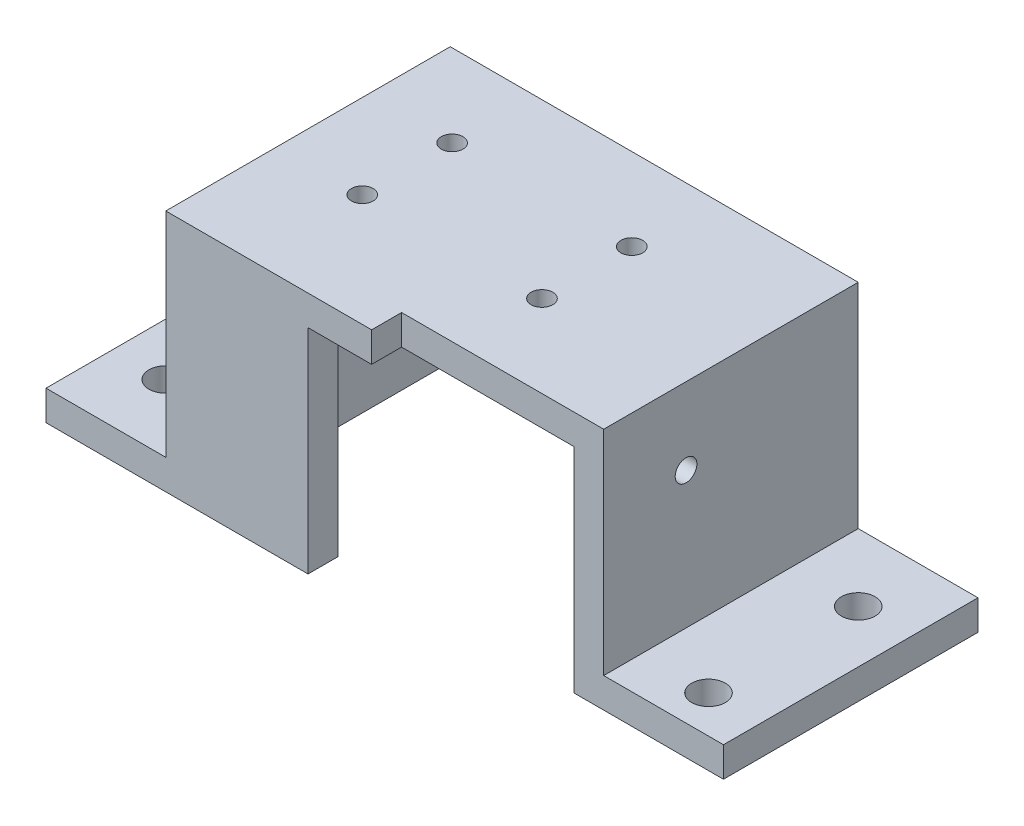
ISO-10303-21;
HEADER;
FILE_DESCRIPTION(('STEP AP214'),'2;1');
FILE_NAME('part.step','',(''),(''),'','','');
FILE_SCHEMA(('AUTOMOTIVE_DESIGN { 1 0 10303 214 1 1 1 1 }'));
ENDSEC;
DATA;
#1=APPLICATION_CONTEXT('core data for automotive mechanical design processes');
#2=APPLICATION_PROTOCOL_DEFINITION('international standard','automotive_design',2000,#1);
#3=PRODUCT_CONTEXT('',#1,'mechanical');
#4=PRODUCT('Part','Part','',(#3));
#5=PRODUCT_RELATED_PRODUCT_CATEGORY('part','',(#4));
#6=PRODUCT_DEFINITION_FORMATION('','',#4);
#7=PRODUCT_DEFINITION_CONTEXT('part definition',#1,'design');
#8=PRODUCT_DEFINITION('design','',#6,#7);
#9=PRODUCT_DEFINITION_SHAPE('','',#8);
#10=(LENGTH_UNIT() NAMED_UNIT(*) SI_UNIT(.MILLI.,.METRE.));
#11=(NAMED_UNIT(*) PLANE_ANGLE_UNIT() SI_UNIT($,.RADIAN.));
#12=(NAMED_UNIT(*) SI_UNIT($,.STERADIAN.) SOLID_ANGLE_UNIT());
#13=UNCERTAINTY_MEASURE_WITH_UNIT(LENGTH_MEASURE(1.E-05),#10,'distance_accuracy_value','');
#14=(GEOMETRIC_REPRESENTATION_CONTEXT(3) GLOBAL_UNCERTAINTY_ASSIGNED_CONTEXT((#13)) GLOBAL_UNIT_ASSIGNED_CONTEXT((#10,
#11,#12)) REPRESENTATION_CONTEXT('',''));
#15=CARTESIAN_POINT('',(0.,0.,0.));
#16=DIRECTION('',(0.,0.,1.));
#17=DIRECTION('',(1.,0.,0.));
#18=AXIS2_PLACEMENT_3D('',#15,#16,#17);
#19=CARTESIAN_POINT('',(0.,-24.5,0.));
#20=DIRECTION('',(0.,-1.,0.));
#21=DIRECTION('',(0.,0.,-1.));
#22=AXIS2_PLACEMENT_3D('',#19,#20,#21);
#23=PLANE('',#22);
#24=CARTESIAN_POINT('',(36.25,-24.5,10.));
#25=DIRECTION('',(0.,1.,0.));
#26=DIRECTION('',(0.,0.,1.));
#27=AXIS2_PLACEMENT_3D('',#24,#25,#26);
#28=CIRCLE('',#27,2.25);
#29=CARTESIAN_POINT('',(36.25,-24.5,12.25));
#30=VERTEX_POINT('',#29);
#31=EDGE_CURVE('E209',#30,#30,#28,.T.);
#32=ORIENTED_EDGE('',*,*,#31,.F.);
#33=EDGE_LOOP('',(#32));
#34=FACE_BOUND('',#33,.T.);
#35=CARTESIAN_POINT('',(36.25,-24.5,-10.));
#36=DIRECTION('',(0.,1.,0.));
#37=DIRECTION('',(0.,0.,1.));
#38=AXIS2_PLACEMENT_3D('',#35,#36,#37);
#39=CIRCLE('',#38,2.25);
#40=CARTESIAN_POINT('',(36.25,-24.5,-7.75));
#41=VERTEX_POINT('',#40);
#42=EDGE_CURVE('E201',#41,#41,#39,.T.);
#43=ORIENTED_EDGE('',*,*,#42,.F.);
#44=EDGE_LOOP('',(#43));
#45=FACE_BOUND('',#44,.T.);
#46=DIRECTION('',(-1.,0.,0.));
#47=VECTOR('',#46,1.);
#48=CARTESIAN_POINT('',(0.,-24.5,15.));
#49=LINE('',#48,#47);
#50=CARTESIAN_POINT('',(43.25,-24.5,15.));
#51=VERTEX_POINT('',#50);
#52=CARTESIAN_POINT('',(27.25,-24.5,15.));
#53=VERTEX_POINT('',#52);
#54=EDGE_CURVE('E196',#51,#53,#49,.T.);
#55=ORIENTED_EDGE('',*,*,#54,.F.);
#56=DIRECTION('',(0.,0.,1.));
#57=VECTOR('',#56,1.);
#58=CARTESIAN_POINT('',(43.25,-24.5,19.));
#59=LINE('',#58,#57);
#60=CARTESIAN_POINT('',(43.25,-24.5,-19.));
#61=VERTEX_POINT('',#60);
#62=EDGE_CURVE('E313',#61,#51,#59,.T.);
#63=ORIENTED_EDGE('',*,*,#62,.F.);
#64=DIRECTION('',(1.,0.,0.));
#65=VECTOR('',#64,1.);
#66=CARTESIAN_POINT('',(27.25,-24.5,-19.));
#67=LINE('',#66,#65);
#68=CARTESIAN_POINT('',(27.25,-24.5,-19.));
#69=VERTEX_POINT('',#68);
#70=EDGE_CURVE('E309',#69,#61,#67,.T.);
#71=ORIENTED_EDGE('',*,*,#70,.F.);
#72=DIRECTION('',(0.,0.,-1.));
#73=VECTOR('',#72,1.);
#74=CARTESIAN_POINT('',(27.25,-24.5,19.));
#75=LINE('',#74,#73);
#76=EDGE_CURVE('E65',#53,#69,#75,.T.);
#77=ORIENTED_EDGE('',*,*,#76,.F.);
#78=EDGE_LOOP('',(#55,#63,#71,#77));
#79=FACE_BOUND('',#78,.T.);
#80=ADVANCED_FACE('F39',(#34,#45,#79),#23,.F.);
#81=CARTESIAN_POINT('',(27.25,4.,-19.));
#82=DIRECTION('',(-1.,0.,0.));
#83=DIRECTION('',(0.,0.,1.));
#84=AXIS2_PLACEMENT_3D('',#81,#82,#83);
#85=PLANE('',#84);
#86=CARTESIAN_POINT('',(27.25,-6.25,3.99999999999999));
#87=DIRECTION('',(1.,0.,0.));
#88=DIRECTION('',(0.,0.,-1.));
#89=AXIS2_PLACEMENT_3D('',#86,#87,#88);
#90=CIRCLE('',#89,1.44999999999999);
#91=CARTESIAN_POINT('',(27.25,-6.25,2.55000000000001));
#92=VERTEX_POINT('',#91);
#93=EDGE_CURVE('E249',#92,#92,#90,.T.);
#94=ORIENTED_EDGE('',*,*,#93,.F.);
#95=EDGE_LOOP('',(#94));
#96=FACE_BOUND('',#95,.T.);
#97=DIRECTION('',(0.,1.,0.));
#98=VECTOR('',#97,1.);
#99=CARTESIAN_POINT('',(27.25,4.,15.));
#100=LINE('',#99,#98);
#101=CARTESIAN_POINT('',(27.25,4.,15.));
#102=VERTEX_POINT('',#101);
#103=EDGE_CURVE('E161',#53,#102,#100,.T.);
#104=ORIENTED_EDGE('',*,*,#103,.F.);
#105=ORIENTED_EDGE('',*,*,#76,.T.);
#106=DIRECTION('',(0.,-1.,0.));
#107=VECTOR('',#106,1.);
#108=CARTESIAN_POINT('',(27.25,4.,-19.));
#109=LINE('',#108,#107);
#110=CARTESIAN_POINT('',(27.25,4.,-19.));
#111=VERTEX_POINT('',#110);
#112=EDGE_CURVE('E11',#111,#69,#109,.T.);
#113=ORIENTED_EDGE('',*,*,#112,.F.);
#114=DIRECTION('',(0.,0.,-1.));
#115=VECTOR('',#114,1.);
#116=CARTESIAN_POINT('',(27.25,4.,-19.));
#117=LINE('',#116,#115);
#118=EDGE_CURVE('E383',#102,#111,#117,.T.);
#119=ORIENTED_EDGE('',*,*,#118,.F.);
#120=EDGE_LOOP('',(#104,#105,#113,#119));
#121=FACE_BOUND('',#120,.T.);
#122=ADVANCED_FACE('F41',(#96,#121),#85,.F.);
#123=CARTESIAN_POINT('',(23.25,-28.5,19.));
#124=DIRECTION('',(1.,0.,0.));
#125=DIRECTION('',(0.,0.,-1.));
#126=AXIS2_PLACEMENT_3D('',#123,#124,#125);
#127=PLANE('',#126);
#128=CARTESIAN_POINT('',(23.25,-6.25,3.99999999999999));
#129=DIRECTION('',(1.,0.,0.));
#130=DIRECTION('',(0.,0.,-1.));
#131=AXIS2_PLACEMENT_3D('',#128,#129,#130);
#132=CIRCLE('',#131,1.44999999999999);
#133=CARTESIAN_POINT('',(23.25,-6.25,2.55000000000001));
#134=VERTEX_POINT('',#133);
#135=EDGE_CURVE('E43',#134,#134,#132,.T.);
#136=ORIENTED_EDGE('',*,*,#135,.T.);
#137=EDGE_LOOP('',(#136));
#138=FACE_BOUND('',#137,.T.);
#139=DIRECTION('',(0.,-1.,0.));
#140=VECTOR('',#139,1.);
#141=CARTESIAN_POINT('',(23.25,-28.5,15.));
#142=LINE('',#141,#140);
#143=CARTESIAN_POINT('',(23.25,0.,15.));
#144=VERTEX_POINT('',#143);
#145=CARTESIAN_POINT('',(23.25,-28.5,15.));
#146=VERTEX_POINT('',#145);
#147=EDGE_CURVE('E182',#144,#146,#142,.T.);
#148=ORIENTED_EDGE('',*,*,#147,.F.);
#149=DIRECTION('',(0.,0.,-1.));
#150=VECTOR('',#149,1.);
#151=CARTESIAN_POINT('',(23.25,0.,19.));
#152=LINE('',#151,#150);
#153=CARTESIAN_POINT('',(23.25,0.,-19.));
#154=VERTEX_POINT('',#153);
#155=EDGE_CURVE('E369',#144,#154,#152,.T.);
#156=ORIENTED_EDGE('',*,*,#155,.T.);
#157=DIRECTION('',(0.,1.,0.));
#158=VECTOR('',#157,1.);
#159=CARTESIAN_POINT('',(23.25,-28.5,-19.));
#160=LINE('',#159,#158);
#161=CARTESIAN_POINT('',(23.25,-28.5,-19.));
#162=VERTEX_POINT('',#161);
#163=EDGE_CURVE('E376',#162,#154,#160,.T.);
#164=ORIENTED_EDGE('',*,*,#163,.F.);
#165=DIRECTION('',(0.,0.,-1.));
#166=VECTOR('',#165,1.);
#167=CARTESIAN_POINT('',(23.25,-28.5,19.));
#168=LINE('',#167,#166);
#169=EDGE_CURVE('E370',#146,#162,#168,.T.);
#170=ORIENTED_EDGE('',*,*,#169,.F.);
#171=EDGE_LOOP('',(#148,#156,#164,#170));
#172=FACE_BOUND('',#171,.T.);
#173=ADVANCED_FACE('F436',(#138,#172),#127,.F.);
#174=CARTESIAN_POINT('',(0.,-28.5,0.));
#175=DIRECTION('',(0.,1.,0.));
#176=DIRECTION('',(0.,0.,1.));
#177=AXIS2_PLACEMENT_3D('',#174,#175,#176);
#178=PLANE('',#177);
#179=CARTESIAN_POINT('',(36.25,-28.5,10.));
#180=DIRECTION('',(0.,1.,0.));
#181=DIRECTION('',(0.,0.,1.));
#182=AXIS2_PLACEMENT_3D('',#179,#180,#181);
#183=CIRCLE('',#182,2.25);
#184=CARTESIAN_POINT('',(36.25,-28.5,12.25));
#185=VERTEX_POINT('',#184);
#186=EDGE_CURVE('E213',#185,#185,#183,.T.);
#187=ORIENTED_EDGE('',*,*,#186,.T.);
#188=EDGE_LOOP('',(#187));
#189=FACE_BOUND('',#188,.T.);
#190=CARTESIAN_POINT('',(36.25,-28.5,-10.));
#191=DIRECTION('',(0.,1.,0.));
#192=DIRECTION('',(0.,0.,1.));
#193=AXIS2_PLACEMENT_3D('',#190,#191,#192);
#194=CIRCLE('',#193,2.25);
#195=CARTESIAN_POINT('',(36.25,-28.5,-7.75));
#196=VERTEX_POINT('',#195);
#197=EDGE_CURVE('E205',#196,#196,#194,.T.);
#198=ORIENTED_EDGE('',*,*,#197,.T.);
#199=EDGE_LOOP('',(#198));
#200=FACE_BOUND('',#199,.T.);
#201=DIRECTION('',(1.,0.,0.));
#202=VECTOR('',#201,1.);
#203=CARTESIAN_POINT('',(43.25,-28.5,15.));
#204=LINE('',#203,#202);
#205=CARTESIAN_POINT('',(43.25,-28.5,15.));
#206=VERTEX_POINT('',#205);
#207=EDGE_CURVE('E57',#146,#206,#204,.T.);
#208=ORIENTED_EDGE('',*,*,#207,.F.);
#209=ORIENTED_EDGE('',*,*,#169,.T.);
#210=DIRECTION('',(1.,0.,0.));
#211=VECTOR('',#210,1.);
#212=CARTESIAN_POINT('',(27.25,-28.5,-19.));
#213=LINE('',#212,#211);
#214=CARTESIAN_POINT('',(43.25,-28.5,-19.));
#215=VERTEX_POINT('',#214);
#216=EDGE_CURVE('E373',#162,#215,#213,.T.);
#217=ORIENTED_EDGE('',*,*,#216,.T.);
#218=DIRECTION('',(0.,0.,1.));
#219=VECTOR('',#218,1.);
#220=CARTESIAN_POINT('',(43.25,-28.5,19.));
#221=LINE('',#220,#219);
#222=EDGE_CURVE('E306',#215,#206,#221,.T.);
#223=ORIENTED_EDGE('',*,*,#222,.T.);
#224=EDGE_LOOP('',(#208,#209,#217,#223));
#225=FACE_BOUND('',#224,.T.);
#226=ADVANCED_FACE('F445',(#189,#200,#225),#178,.F.);
#227=CARTESIAN_POINT('',(43.25,-24.5,19.));
#228=DIRECTION('',(1.,0.,0.));
#229=DIRECTION('',(0.,0.,-1.));
#230=AXIS2_PLACEMENT_3D('',#227,#228,#229);
#231=PLANE('',#230);
#232=ORIENTED_EDGE('',*,*,#62,.T.);
#233=DIRECTION('',(0.,1.,0.));
#234=VECTOR('',#233,1.);
#235=CARTESIAN_POINT('',(43.25,-28.5,15.));
#236=LINE('',#235,#234);
#237=EDGE_CURVE('E166',#206,#51,#236,.T.);
#238=ORIENTED_EDGE('',*,*,#237,.F.);
#239=ORIENTED_EDGE('',*,*,#222,.F.);
#240=DIRECTION('',(0.,-1.,0.));
#241=VECTOR('',#240,1.);
#242=CARTESIAN_POINT('',(43.25,-24.5,-19.));
#243=LINE('',#242,#241);
#244=EDGE_CURVE('E317',#61,#215,#243,.T.);
#245=ORIENTED_EDGE('',*,*,#244,.F.);
#246=EDGE_LOOP('',(#232,#238,#239,#245));
#247=FACE_BOUND('',#246,.T.);
#248=ADVANCED_FACE('F442',(#247),#231,.T.);
#249=CARTESIAN_POINT('',(0.,0.,0.));
#250=DIRECTION('',(0.,1.,0.));
#251=DIRECTION('',(0.,0.,1.));
#252=AXIS2_PLACEMENT_3D('',#249,#250,#251);
#253=PLANE('',#252);
#254=CARTESIAN_POINT('',(8.,0.,-8.));
#255=DIRECTION('',(0.,1.,0.));
#256=DIRECTION('',(0.,0.,1.));
#257=AXIS2_PLACEMENT_3D('',#254,#255,#256);
#258=CIRCLE('',#257,1.44999999999999);
#259=CARTESIAN_POINT('',(8.,0.,-6.55000000000001));
#260=VERTEX_POINT('',#259);
#261=EDGE_CURVE('E257',#260,#260,#258,.T.);
#262=ORIENTED_EDGE('',*,*,#261,.T.);
#263=EDGE_LOOP('',(#262));
#264=FACE_BOUND('',#263,.T.);
#265=CARTESIAN_POINT('',(7.99999999999999,0.,4.));
#266=DIRECTION('',(0.,1.,0.));
#267=DIRECTION('',(0.,0.,1.));
#268=AXIS2_PLACEMENT_3D('',#265,#266,#267);
#269=CIRCLE('',#268,1.44999999999999);
#270=CARTESIAN_POINT('',(7.99999999999999,0.,5.44999999999999));
#271=VERTEX_POINT('',#270);
#272=EDGE_CURVE('E265',#271,#271,#269,.T.);
#273=ORIENTED_EDGE('',*,*,#272,.T.);
#274=EDGE_LOOP('',(#273));
#275=FACE_BOUND('',#274,.T.);
#276=CARTESIAN_POINT('',(-16.,0.,4.));
#277=DIRECTION('',(0.,1.,0.));
#278=DIRECTION('',(0.,0.,1.));
#279=AXIS2_PLACEMENT_3D('',#276,#277,#278);
#280=CIRCLE('',#279,1.44999999999999);
#281=CARTESIAN_POINT('',(-16.,0.,5.44999999999999));
#282=VERTEX_POINT('',#281);
#283=EDGE_CURVE('E273',#282,#282,#280,.T.);
#284=ORIENTED_EDGE('',*,*,#283,.T.);
#285=EDGE_LOOP('',(#284));
#286=FACE_BOUND('',#285,.T.);
#287=CARTESIAN_POINT('',(-16.,0.,-8.));
#288=DIRECTION('',(0.,1.,0.));
#289=DIRECTION('',(0.,0.,1.));
#290=AXIS2_PLACEMENT_3D('',#287,#288,#289);
#291=CIRCLE('',#290,1.44999999999999);
#292=CARTESIAN_POINT('',(-16.,0.,-6.55000000000001));
#293=VERTEX_POINT('',#292);
#294=EDGE_CURVE('E281',#293,#293,#291,.T.);
#295=ORIENTED_EDGE('',*,*,#294,.T.);
#296=EDGE_LOOP('',(#295));
#297=FACE_BOUND('',#296,.T.);
#298=DIRECTION('',(1.,0.,0.));
#299=VECTOR('',#298,1.);
#300=CARTESIAN_POINT('',(0.,0.,15.));
#301=LINE('',#300,#299);
#302=CARTESIAN_POINT('',(0.25,0.,15.));
#303=VERTEX_POINT('',#302);
#304=EDGE_CURVE('E186',#303,#144,#301,.T.);
#305=ORIENTED_EDGE('',*,*,#304,.F.);
#306=DIRECTION('',(0.,0.,1.));
#307=VECTOR('',#306,1.);
#308=CARTESIAN_POINT('',(0.25,0.,0.));
#309=LINE('',#308,#307);
#310=CARTESIAN_POINT('',(0.25,0.,19.));
#311=VERTEX_POINT('',#310);
#312=EDGE_CURVE('E173',#303,#311,#309,.T.);
#313=ORIENTED_EDGE('',*,*,#312,.T.);
#314=DIRECTION('',(1.,0.,0.));
#315=VECTOR('',#314,1.);
#316=CARTESIAN_POINT('',(-27.25,0.,19.));
#317=LINE('',#316,#315);
#318=CARTESIAN_POINT('',(-8.25,0.,19.));
#319=VERTEX_POINT('',#318);
#320=EDGE_CURVE('E387',#319,#311,#317,.T.);
#321=ORIENTED_EDGE('',*,*,#320,.F.);
#322=DIRECTION('',(0.,0.,1.));
#323=VECTOR('',#322,1.);
#324=CARTESIAN_POINT('',(-8.25,0.,19.));
#325=LINE('',#324,#323);
#326=CARTESIAN_POINT('',(-8.25,0.,15.));
#327=VERTEX_POINT('',#326);
#328=EDGE_CURVE('E286',#327,#319,#325,.T.);
#329=ORIENTED_EDGE('',*,*,#328,.F.);
#330=DIRECTION('',(1.,0.,0.));
#331=VECTOR('',#330,1.);
#332=CARTESIAN_POINT('',(-23.25,0.,15.));
#333=LINE('',#332,#331);
#334=CARTESIAN_POINT('',(-23.25,0.,15.));
#335=VERTEX_POINT('',#334);
#336=EDGE_CURVE('E291',#335,#327,#333,.T.);
#337=ORIENTED_EDGE('',*,*,#336,.F.);
#338=DIRECTION('',(0.,0.,1.));
#339=VECTOR('',#338,1.);
#340=CARTESIAN_POINT('',(-23.25,0.,19.));
#341=LINE('',#340,#339);
#342=CARTESIAN_POINT('',(-23.25,0.,-19.));
#343=VERTEX_POINT('',#342);
#344=EDGE_CURVE('E349',#343,#335,#341,.T.);
#345=ORIENTED_EDGE('',*,*,#344,.F.);
#346=DIRECTION('',(-1.,0.,0.));
#347=VECTOR('',#346,1.);
#348=CARTESIAN_POINT('',(-27.25,0.,-19.));
#349=LINE('',#348,#347);
#350=EDGE_CURVE('E382',#154,#343,#349,.T.);
#351=ORIENTED_EDGE('',*,*,#350,.F.);
#352=ORIENTED_EDGE('',*,*,#155,.F.);
#353=EDGE_LOOP('',(#305,#313,#321,#329,#337,#345,#351,#352));
#354=FACE_BOUND('',#353,.T.);
#355=ADVANCED_FACE('F411',(#264,#275,#286,#297,#354),#253,.F.);
#356=CARTESIAN_POINT('',(-23.25,-28.5,19.));
#357=DIRECTION('',(-1.,0.,0.));
#358=DIRECTION('',(0.,0.,1.));
#359=AXIS2_PLACEMENT_3D('',#356,#357,#358);
#360=PLANE('',#359);
#361=CARTESIAN_POINT('',(-23.25,-6.25,4.));
#362=DIRECTION('',(-1.,0.,0.));
#363=DIRECTION('',(0.,0.,1.));
#364=AXIS2_PLACEMENT_3D('',#361,#362,#363);
#365=CIRCLE('',#364,1.44999999999999);
#366=CARTESIAN_POINT('',(-23.25,-6.25,5.44999999999999));
#367=VERTEX_POINT('',#366);
#368=EDGE_CURVE('E237',#367,#367,#365,.T.);
#369=ORIENTED_EDGE('',*,*,#368,.T.);
#370=EDGE_LOOP('',(#369));
#371=FACE_BOUND('',#370,.T.);
#372=CARTESIAN_POINT('',(-23.25,-6.25,-8.));
#373=DIRECTION('',(-1.,0.,0.));
#374=DIRECTION('',(0.,0.,1.));
#375=AXIS2_PLACEMENT_3D('',#372,#373,#374);
#376=CIRCLE('',#375,1.44999999999999);
#377=CARTESIAN_POINT('',(-23.25,-6.25,-6.55000000000001));
#378=VERTEX_POINT('',#377);
#379=EDGE_CURVE('E245',#378,#378,#376,.T.);
#380=ORIENTED_EDGE('',*,*,#379,.T.);
#381=EDGE_LOOP('',(#380));
#382=FACE_BOUND('',#381,.T.);
#383=DIRECTION('',(0.,1.,0.));
#384=VECTOR('',#383,1.);
#385=CARTESIAN_POINT('',(-23.25,-28.5,15.));
#386=LINE('',#385,#384);
#387=CARTESIAN_POINT('',(-23.25,-28.5,15.));
#388=VERTEX_POINT('',#387);
#389=EDGE_CURVE('E303',#388,#335,#386,.T.);
#390=ORIENTED_EDGE('',*,*,#389,.F.);
#391=DIRECTION('',(0.,0.,1.));
#392=VECTOR('',#391,1.);
#393=CARTESIAN_POINT('',(-23.25,-28.5,19.));
#394=LINE('',#393,#392);
#395=CARTESIAN_POINT('',(-23.25,-28.5,-19.));
#396=VERTEX_POINT('',#395);
#397=EDGE_CURVE('E356',#396,#388,#394,.T.);
#398=ORIENTED_EDGE('',*,*,#397,.F.);
#399=DIRECTION('',(0.,1.,0.));
#400=VECTOR('',#399,1.);
#401=CARTESIAN_POINT('',(-23.25,-28.5,-19.));
#402=LINE('',#401,#400);
#403=EDGE_CURVE('E363',#396,#343,#402,.T.);
#404=ORIENTED_EDGE('',*,*,#403,.T.);
#405=ORIENTED_EDGE('',*,*,#344,.T.);
#406=EDGE_LOOP('',(#390,#398,#404,#405));
#407=FACE_BOUND('',#406,.T.);
#408=ADVANCED_FACE('F459',(#371,#382,#407),#360,.F.);
#409=CARTESIAN_POINT('',(-27.25,4.,-19.));
#410=DIRECTION('',(0.,0.,1.));
#411=DIRECTION('',(1.,0.,0.));
#412=AXIS2_PLACEMENT_3D('',#409,#410,#411);
#413=PLANE('',#412);
#414=ORIENTED_EDGE('',*,*,#112,.T.);
#415=ORIENTED_EDGE('',*,*,#70,.T.);
#416=ORIENTED_EDGE('',*,*,#244,.T.);
#417=ORIENTED_EDGE('',*,*,#216,.F.);
#418=ORIENTED_EDGE('',*,*,#163,.T.);
#419=ORIENTED_EDGE('',*,*,#350,.T.);
#420=ORIENTED_EDGE('',*,*,#403,.F.);
#421=DIRECTION('',(1.,0.,0.));
#422=VECTOR('',#421,1.);
#423=CARTESIAN_POINT('',(-27.25,-28.5,-19.));
#424=LINE('',#423,#422);
#425=CARTESIAN_POINT('',(-43.25,-28.5,-19.));
#426=VERTEX_POINT('',#425);
#427=EDGE_CURVE('E353',#426,#396,#424,.T.);
#428=ORIENTED_EDGE('',*,*,#427,.F.);
#429=DIRECTION('',(0.,-1.,0.));
#430=VECTOR('',#429,1.);
#431=CARTESIAN_POINT('',(-43.25,-24.5,-19.));
#432=LINE('',#431,#430);
#433=CARTESIAN_POINT('',(-43.25,-24.5,-19.));
#434=VERTEX_POINT('',#433);
#435=EDGE_CURVE('E345',#434,#426,#432,.T.);
#436=ORIENTED_EDGE('',*,*,#435,.F.);
#437=DIRECTION('',(1.,0.,0.));
#438=VECTOR('',#437,1.);
#439=CARTESIAN_POINT('',(-27.25,-24.5,-19.));
#440=LINE('',#439,#438);
#441=CARTESIAN_POINT('',(-27.25,-24.5,-19.));
#442=VERTEX_POINT('',#441);
#443=EDGE_CURVE('E337',#434,#442,#440,.T.);
#444=ORIENTED_EDGE('',*,*,#443,.T.);
#445=DIRECTION('',(0.,-1.,0.));
#446=VECTOR('',#445,1.);
#447=CARTESIAN_POINT('',(-27.25,4.,-19.));
#448=LINE('',#447,#446);
#449=CARTESIAN_POINT('',(-27.25,4.,-19.));
#450=VERTEX_POINT('',#449);
#451=EDGE_CURVE('E49',#450,#442,#448,.T.);
#452=ORIENTED_EDGE('',*,*,#451,.F.);
#453=DIRECTION('',(-1.,0.,0.));
#454=VECTOR('',#453,1.);
#455=CARTESIAN_POINT('',(-27.25,4.,-19.));
#456=LINE('',#455,#454);
#457=EDGE_CURVE('E386',#111,#450,#456,.T.);
#458=ORIENTED_EDGE('',*,*,#457,.F.);
#459=EDGE_LOOP('',(#414,#415,#416,#417,#418,#419,#420,#428,#436,#444,#452,#458));
#460=FACE_BOUND('',#459,.T.);
#461=ADVANCED_FACE('F462',(#460),#413,.F.);
#462=CARTESIAN_POINT('',(-27.25,4.,-19.));
#463=DIRECTION('',(1.,0.,0.));
#464=DIRECTION('',(0.,0.,-1.));
#465=AXIS2_PLACEMENT_3D('',#462,#463,#464);
#466=PLANE('',#465);
#467=CARTESIAN_POINT('',(-27.25,-6.25,4.));
#468=DIRECTION('',(-1.,0.,0.));
#469=DIRECTION('',(0.,0.,1.));
#470=AXIS2_PLACEMENT_3D('',#467,#468,#469);
#471=CIRCLE('',#470,1.44999999999999);
#472=CARTESIAN_POINT('',(-27.25,-6.25,5.44999999999999));
#473=VERTEX_POINT('',#472);
#474=EDGE_CURVE('E233',#473,#473,#471,.T.);
#475=ORIENTED_EDGE('',*,*,#474,.F.);
#476=EDGE_LOOP('',(#475));
#477=FACE_BOUND('',#476,.T.);
#478=CARTESIAN_POINT('',(-27.25,-6.25,-8.));
#479=DIRECTION('',(-1.,0.,0.));
#480=DIRECTION('',(0.,0.,1.));
#481=AXIS2_PLACEMENT_3D('',#478,#479,#480);
#482=CIRCLE('',#481,1.44999999999999);
#483=CARTESIAN_POINT('',(-27.25,-6.25,-6.55000000000001));
#484=VERTEX_POINT('',#483);
#485=EDGE_CURVE('E241',#484,#484,#482,.T.);
#486=ORIENTED_EDGE('',*,*,#485,.F.);
#487=EDGE_LOOP('',(#486));
#488=FACE_BOUND('',#487,.T.);
#489=ORIENTED_EDGE('',*,*,#451,.T.);
#490=DIRECTION('',(0.,0.,1.));
#491=VECTOR('',#490,1.);
#492=CARTESIAN_POINT('',(-27.25,-24.5,19.));
#493=LINE('',#492,#491);
#494=CARTESIAN_POINT('',(-27.25,-24.5,19.));
#495=VERTEX_POINT('',#494);
#496=EDGE_CURVE('E325',#442,#495,#493,.T.);
#497=ORIENTED_EDGE('',*,*,#496,.T.);
#498=DIRECTION('',(0.,-1.,0.));
#499=VECTOR('',#498,1.);
#500=CARTESIAN_POINT('',(-27.25,4.,19.));
#501=LINE('',#500,#499);
#502=CARTESIAN_POINT('',(-27.25,4.,19.));
#503=VERTEX_POINT('',#502);
#504=EDGE_CURVE('E395',#503,#495,#501,.T.);
#505=ORIENTED_EDGE('',*,*,#504,.F.);
#506=DIRECTION('',(0.,0.,1.));
#507=VECTOR('',#506,1.);
#508=CARTESIAN_POINT('',(-27.25,4.,-19.));
#509=LINE('',#508,#507);
#510=EDGE_CURVE('E390',#450,#503,#509,.T.);
#511=ORIENTED_EDGE('',*,*,#510,.F.);
#512=EDGE_LOOP('',(#489,#497,#505,#511));
#513=FACE_BOUND('',#512,.T.);
#514=ADVANCED_FACE('F478',(#477,#488,#513),#466,.F.);
#515=CARTESIAN_POINT('',(-27.25,4.,19.));
#516=DIRECTION('',(0.,0.,-1.));
#517=DIRECTION('',(-1.,0.,0.));
#518=AXIS2_PLACEMENT_3D('',#515,#516,#517);
#519=PLANE('',#518);
#520=ORIENTED_EDGE('',*,*,#320,.T.);
#521=DIRECTION('',(0.,-1.,0.));
#522=VECTOR('',#521,1.);
#523=CARTESIAN_POINT('',(0.25,-28.5,19.));
#524=LINE('',#523,#522);
#525=CARTESIAN_POINT('',(0.25,4.,19.));
#526=VERTEX_POINT('',#525);
#527=EDGE_CURVE('E190',#526,#311,#524,.T.);
#528=ORIENTED_EDGE('',*,*,#527,.F.);
#529=DIRECTION('',(1.,0.,0.));
#530=VECTOR('',#529,1.);
#531=CARTESIAN_POINT('',(-27.25,4.,19.));
#532=LINE('',#531,#530);
#533=EDGE_CURVE('E180',#503,#526,#532,.T.);
#534=ORIENTED_EDGE('',*,*,#533,.F.);
#535=ORIENTED_EDGE('',*,*,#504,.T.);
#536=DIRECTION('',(-1.,0.,0.));
#537=VECTOR('',#536,1.);
#538=CARTESIAN_POINT('',(-27.25,-24.5,19.));
#539=LINE('',#538,#537);
#540=CARTESIAN_POINT('',(-43.25,-24.5,19.));
#541=VERTEX_POINT('',#540);
#542=EDGE_CURVE('E329',#495,#541,#539,.T.);
#543=ORIENTED_EDGE('',*,*,#542,.T.);
#544=DIRECTION('',(0.,-1.,0.));
#545=VECTOR('',#544,1.);
#546=CARTESIAN_POINT('',(-43.25,-24.5,19.));
#547=LINE('',#546,#545);
#548=CARTESIAN_POINT('',(-43.25,-28.5,19.));
#549=VERTEX_POINT('',#548);
#550=EDGE_CURVE('E341',#541,#549,#547,.T.);
#551=ORIENTED_EDGE('',*,*,#550,.T.);
#552=DIRECTION('',(-1.,0.,0.));
#553=VECTOR('',#552,1.);
#554=CARTESIAN_POINT('',(-27.25,-28.5,19.));
#555=LINE('',#554,#553);
#556=CARTESIAN_POINT('',(-8.25,-28.5,19.));
#557=VERTEX_POINT('',#556);
#558=EDGE_CURVE('E360',#557,#549,#555,.T.);
#559=ORIENTED_EDGE('',*,*,#558,.F.);
#560=DIRECTION('',(0.,1.,0.));
#561=VECTOR('',#560,1.);
#562=CARTESIAN_POINT('',(-8.25,-28.5,19.));
#563=LINE('',#562,#561);
#564=EDGE_CURVE('E290',#557,#319,#563,.T.);
#565=ORIENTED_EDGE('',*,*,#564,.T.);
#566=EDGE_LOOP('',(#520,#528,#534,#535,#543,#551,#559,#565));
#567=FACE_BOUND('',#566,.T.);
#568=ADVANCED_FACE('F472',(#567),#519,.F.);
#569=CARTESIAN_POINT('',(0.,4.,0.));
#570=DIRECTION('',(0.,1.,0.));
#571=DIRECTION('',(0.,0.,1.));
#572=AXIS2_PLACEMENT_3D('',#569,#570,#571);
#573=PLANE('',#572);
#574=DIRECTION('',(0.,0.,1.));
#575=VECTOR('',#574,1.);
#576=CARTESIAN_POINT('',(0.25,4.,15.));
#577=LINE('',#576,#575);
#578=CARTESIAN_POINT('',(0.25,4.,15.));
#579=VERTEX_POINT('',#578);
#580=EDGE_CURVE('E170',#579,#526,#577,.T.);
#581=ORIENTED_EDGE('',*,*,#580,.F.);
#582=DIRECTION('',(-1.,0.,0.));
#583=VECTOR('',#582,1.);
#584=CARTESIAN_POINT('',(43.25,4.,15.));
#585=LINE('',#584,#583);
#586=EDGE_CURVE('E156',#102,#579,#585,.T.);
#587=ORIENTED_EDGE('',*,*,#586,.F.);
#588=ORIENTED_EDGE('',*,*,#118,.T.);
#589=ORIENTED_EDGE('',*,*,#457,.T.);
#590=ORIENTED_EDGE('',*,*,#510,.T.);
#591=ORIENTED_EDGE('',*,*,#533,.T.);
#592=EDGE_LOOP('',(#581,#587,#588,#589,#590,#591));
#593=FACE_BOUND('',#592,.T.);
#594=CARTESIAN_POINT('',(8.,4.,-8.));
#595=DIRECTION('',(0.,1.,0.));
#596=DIRECTION('',(0.,0.,1.));
#597=AXIS2_PLACEMENT_3D('',#594,#595,#596);
#598=CIRCLE('',#597,1.44999999999999);
#599=CARTESIAN_POINT('',(8.,4.,-6.55000000000001));
#600=VERTEX_POINT('',#599);
#601=EDGE_CURVE('E253',#600,#600,#598,.T.);
#602=ORIENTED_EDGE('',*,*,#601,.F.);
#603=EDGE_LOOP('',(#602));
#604=FACE_BOUND('',#603,.T.);
#605=CARTESIAN_POINT('',(7.99999999999999,4.,4.));
#606=DIRECTION('',(0.,1.,0.));
#607=DIRECTION('',(0.,0.,1.));
#608=AXIS2_PLACEMENT_3D('',#605,#606,#607);
#609=CIRCLE('',#608,1.44999999999999);
#610=CARTESIAN_POINT('',(7.99999999999999,4.,5.44999999999999));
#611=VERTEX_POINT('',#610);
#612=EDGE_CURVE('E261',#611,#611,#609,.T.);
#613=ORIENTED_EDGE('',*,*,#612,.F.);
#614=EDGE_LOOP('',(#613));
#615=FACE_BOUND('',#614,.T.);
#616=CARTESIAN_POINT('',(-16.,4.,4.));
#617=DIRECTION('',(0.,1.,0.));
#618=DIRECTION('',(0.,0.,1.));
#619=AXIS2_PLACEMENT_3D('',#616,#617,#618);
#620=CIRCLE('',#619,1.44999999999999);
#621=CARTESIAN_POINT('',(-16.,4.,5.44999999999999));
#622=VERTEX_POINT('',#621);
#623=EDGE_CURVE('E269',#622,#622,#620,.T.);
#624=ORIENTED_EDGE('',*,*,#623,.F.);
#625=EDGE_LOOP('',(#624));
#626=FACE_BOUND('',#625,.T.);
#627=CARTESIAN_POINT('',(-16.,4.,-8.));
#628=DIRECTION('',(0.,1.,0.));
#629=DIRECTION('',(0.,0.,1.));
#630=AXIS2_PLACEMENT_3D('',#627,#628,#629);
#631=CIRCLE('',#630,1.44999999999999);
#632=CARTESIAN_POINT('',(-16.,4.,-6.55000000000001));
#633=VERTEX_POINT('',#632);
#634=EDGE_CURVE('E277',#633,#633,#631,.T.);
#635=ORIENTED_EDGE('',*,*,#634,.F.);
#636=EDGE_LOOP('',(#635));
#637=FACE_BOUND('',#636,.T.);
#638=ADVANCED_FACE('F177',(#593,#604,#615,#626,#637),#573,.T.);
#639=CARTESIAN_POINT('',(0.,-28.5,0.));
#640=DIRECTION('',(0.,-1.,0.));
#641=DIRECTION('',(0.,0.,-1.));
#642=AXIS2_PLACEMENT_3D('',#639,#640,#641);
#643=PLANE('',#642);
#644=CARTESIAN_POINT('',(-36.25,-28.5,10.));
#645=DIRECTION('',(0.,-1.,0.));
#646=DIRECTION('',(0.,0.,-1.));
#647=AXIS2_PLACEMENT_3D('',#644,#645,#646);
#648=CIRCLE('',#647,2.25);
#649=CARTESIAN_POINT('',(-36.25,-28.5,7.75));
#650=VERTEX_POINT('',#649);
#651=EDGE_CURVE('E221',#650,#650,#648,.T.);
#652=ORIENTED_EDGE('',*,*,#651,.F.);
#653=EDGE_LOOP('',(#652));
#654=FACE_BOUND('',#653,.T.);
#655=CARTESIAN_POINT('',(-36.25,-28.5,-10.));
#656=DIRECTION('',(0.,-1.,0.));
#657=DIRECTION('',(0.,0.,-1.));
#658=AXIS2_PLACEMENT_3D('',#655,#656,#657);
#659=CIRCLE('',#658,2.25);
#660=CARTESIAN_POINT('',(-36.25,-28.5,-12.25));
#661=VERTEX_POINT('',#660);
#662=EDGE_CURVE('E229',#661,#661,#659,.T.);
#663=ORIENTED_EDGE('',*,*,#662,.F.);
#664=EDGE_LOOP('',(#663));
#665=FACE_BOUND('',#664,.T.);
#666=ORIENTED_EDGE('',*,*,#558,.T.);
#667=DIRECTION('',(0.,0.,-1.));
#668=VECTOR('',#667,1.);
#669=CARTESIAN_POINT('',(-43.25,-28.5,19.));
#670=LINE('',#669,#668);
#671=EDGE_CURVE('E324',#549,#426,#670,.T.);
#672=ORIENTED_EDGE('',*,*,#671,.T.);
#673=ORIENTED_EDGE('',*,*,#427,.T.);
#674=ORIENTED_EDGE('',*,*,#397,.T.);
#675=DIRECTION('',(1.,0.,0.));
#676=VECTOR('',#675,1.);
#677=CARTESIAN_POINT('',(-23.25,-28.5,15.));
#678=LINE('',#677,#676);
#679=CARTESIAN_POINT('',(-8.25,-28.5,15.));
#680=VERTEX_POINT('',#679);
#681=EDGE_CURVE('E282',#388,#680,#678,.T.);
#682=ORIENTED_EDGE('',*,*,#681,.T.);
#683=DIRECTION('',(0.,0.,1.));
#684=VECTOR('',#683,1.);
#685=CARTESIAN_POINT('',(-8.25,-28.5,19.));
#686=LINE('',#685,#684);
#687=EDGE_CURVE('E285',#680,#557,#686,.T.);
#688=ORIENTED_EDGE('',*,*,#687,.T.);
#689=EDGE_LOOP('',(#666,#672,#673,#674,#682,#688));
#690=FACE_BOUND('',#689,.T.);
#691=ADVANCED_FACE('F454',(#654,#665,#690),#643,.T.);
#692=CARTESIAN_POINT('',(-43.25,-24.5,19.));
#693=DIRECTION('',(-1.,0.,0.));
#694=DIRECTION('',(0.,0.,1.));
#695=AXIS2_PLACEMENT_3D('',#692,#693,#694);
#696=PLANE('',#695);
#697=ORIENTED_EDGE('',*,*,#671,.F.);
#698=ORIENTED_EDGE('',*,*,#550,.F.);
#699=DIRECTION('',(0.,0.,-1.));
#700=VECTOR('',#699,1.);
#701=CARTESIAN_POINT('',(-43.25,-24.5,19.));
#702=LINE('',#701,#700);
#703=EDGE_CURVE('E333',#541,#434,#702,.T.);
#704=ORIENTED_EDGE('',*,*,#703,.T.);
#705=ORIENTED_EDGE('',*,*,#435,.T.);
#706=EDGE_LOOP('',(#697,#698,#704,#705));
#707=FACE_BOUND('',#706,.T.);
#708=ADVANCED_FACE('F450',(#707),#696,.T.);
#709=CARTESIAN_POINT('',(0.,-24.5,0.));
#710=DIRECTION('',(0.,1.,0.));
#711=DIRECTION('',(0.,0.,1.));
#712=AXIS2_PLACEMENT_3D('',#709,#710,#711);
#713=PLANE('',#712);
#714=CARTESIAN_POINT('',(-36.25,-24.5,10.));
#715=DIRECTION('',(0.,1.,0.));
#716=DIRECTION('',(0.,0.,1.));
#717=AXIS2_PLACEMENT_3D('',#714,#715,#716);
#718=CIRCLE('',#717,2.25);
#719=CARTESIAN_POINT('',(-36.25,-24.5,12.25));
#720=VERTEX_POINT('',#719);
#721=EDGE_CURVE('E217',#720,#720,#718,.T.);
#722=ORIENTED_EDGE('',*,*,#721,.F.);
#723=EDGE_LOOP('',(#722));
#724=FACE_BOUND('',#723,.T.);
#725=CARTESIAN_POINT('',(-36.25,-24.5,-10.));
#726=DIRECTION('',(0.,1.,0.));
#727=DIRECTION('',(0.,0.,1.));
#728=AXIS2_PLACEMENT_3D('',#725,#726,#727);
#729=CIRCLE('',#728,2.25);
#730=CARTESIAN_POINT('',(-36.25,-24.5,-7.75));
#731=VERTEX_POINT('',#730);
#732=EDGE_CURVE('E225',#731,#731,#729,.T.);
#733=ORIENTED_EDGE('',*,*,#732,.F.);
#734=EDGE_LOOP('',(#733));
#735=FACE_BOUND('',#734,.T.);
#736=ORIENTED_EDGE('',*,*,#496,.F.);
#737=ORIENTED_EDGE('',*,*,#443,.F.);
#738=ORIENTED_EDGE('',*,*,#703,.F.);
#739=ORIENTED_EDGE('',*,*,#542,.F.);
#740=EDGE_LOOP('',(#736,#737,#738,#739));
#741=FACE_BOUND('',#740,.T.);
#742=ADVANCED_FACE('F447',(#724,#735,#741),#713,.T.);
#743=CARTESIAN_POINT('',(-23.25,-28.5,15.));
#744=DIRECTION('',(0.,0.,1.));
#745=DIRECTION('',(1.,0.,0.));
#746=AXIS2_PLACEMENT_3D('',#743,#744,#745);
#747=PLANE('',#746);
#748=ORIENTED_EDGE('',*,*,#336,.T.);
#749=DIRECTION('',(0.,1.,0.));
#750=VECTOR('',#749,1.);
#751=CARTESIAN_POINT('',(-8.25,-28.5,15.));
#752=LINE('',#751,#750);
#753=EDGE_CURVE('E299',#680,#327,#752,.T.);
#754=ORIENTED_EDGE('',*,*,#753,.F.);
#755=ORIENTED_EDGE('',*,*,#681,.F.);
#756=ORIENTED_EDGE('',*,*,#389,.T.);
#757=EDGE_LOOP('',(#748,#754,#755,#756));
#758=FACE_BOUND('',#757,.T.);
#759=ADVANCED_FACE('F427',(#758),#747,.F.);
#760=CARTESIAN_POINT('',(-8.25,-28.5,19.));
#761=DIRECTION('',(-1.,0.,0.));
#762=DIRECTION('',(0.,0.,1.));
#763=AXIS2_PLACEMENT_3D('',#760,#761,#762);
#764=PLANE('',#763);
#765=ORIENTED_EDGE('',*,*,#328,.T.);
#766=ORIENTED_EDGE('',*,*,#564,.F.);
#767=ORIENTED_EDGE('',*,*,#687,.F.);
#768=ORIENTED_EDGE('',*,*,#753,.T.);
#769=EDGE_LOOP('',(#765,#766,#767,#768));
#770=FACE_BOUND('',#769,.T.);
#771=ADVANCED_FACE('F417',(#770),#764,.F.);
#772=CARTESIAN_POINT('',(-16.,4.,-8.));
#773=DIRECTION('',(0.,1.,0.));
#774=DIRECTION('',(0.,0.,1.));
#775=AXIS2_PLACEMENT_3D('',#772,#773,#774);
#776=CYLINDRICAL_SURFACE('',#775,1.44999999999999);
#777=ORIENTED_EDGE('',*,*,#634,.T.);
#778=EDGE_LOOP('',(#777));
#779=FACE_BOUND('',#778,.T.);
#780=ORIENTED_EDGE('',*,*,#294,.F.);
#781=EDGE_LOOP('',(#780));
#782=FACE_BOUND('',#781,.T.);
#783=ADVANCED_FACE('F414',(#779,#782),#776,.F.);
#784=CARTESIAN_POINT('',(-16.,4.,4.));
#785=DIRECTION('',(0.,1.,0.));
#786=DIRECTION('',(0.,0.,1.));
#787=AXIS2_PLACEMENT_3D('',#784,#785,#786);
#788=CYLINDRICAL_SURFACE('',#787,1.44999999999999);
#789=ORIENTED_EDGE('',*,*,#623,.T.);
#790=EDGE_LOOP('',(#789));
#791=FACE_BOUND('',#790,.T.);
#792=ORIENTED_EDGE('',*,*,#283,.F.);
#793=EDGE_LOOP('',(#792));
#794=FACE_BOUND('',#793,.T.);
#795=ADVANCED_FACE('F416',(#791,#794),#788,.F.);
#796=CARTESIAN_POINT('',(7.99999999999999,4.,4.));
#797=DIRECTION('',(0.,1.,0.));
#798=DIRECTION('',(0.,0.,1.));
#799=AXIS2_PLACEMENT_3D('',#796,#797,#798);
#800=CYLINDRICAL_SURFACE('',#799,1.44999999999999);
#801=ORIENTED_EDGE('',*,*,#612,.T.);
#802=EDGE_LOOP('',(#801));
#803=FACE_BOUND('',#802,.T.);
#804=ORIENTED_EDGE('',*,*,#272,.F.);
#805=EDGE_LOOP('',(#804));
#806=FACE_BOUND('',#805,.T.);
#807=ADVANCED_FACE('F424',(#803,#806),#800,.F.);
#808=CARTESIAN_POINT('',(8.,4.,-8.));
#809=DIRECTION('',(0.,1.,0.));
#810=DIRECTION('',(0.,0.,1.));
#811=AXIS2_PLACEMENT_3D('',#808,#809,#810);
#812=CYLINDRICAL_SURFACE('',#811,1.44999999999999);
#813=ORIENTED_EDGE('',*,*,#601,.T.);
#814=EDGE_LOOP('',(#813));
#815=FACE_BOUND('',#814,.T.);
#816=ORIENTED_EDGE('',*,*,#261,.F.);
#817=EDGE_LOOP('',(#816));
#818=FACE_BOUND('',#817,.T.);
#819=ADVANCED_FACE('F552',(#815,#818),#812,.F.);
#820=CARTESIAN_POINT('',(27.25,-6.25,3.99999999999999));
#821=DIRECTION('',(1.,0.,0.));
#822=DIRECTION('',(0.,0.,-1.));
#823=AXIS2_PLACEMENT_3D('',#820,#821,#822);
#824=CYLINDRICAL_SURFACE('',#823,1.44999999999999);
#825=ORIENTED_EDGE('',*,*,#93,.T.);
#826=EDGE_LOOP('',(#825));
#827=FACE_BOUND('',#826,.T.);
#828=ORIENTED_EDGE('',*,*,#135,.F.);
#829=EDGE_LOOP('',(#828));
#830=FACE_BOUND('',#829,.T.);
#831=ADVANCED_FACE('F562',(#827,#830),#824,.F.);
#832=CARTESIAN_POINT('',(-27.25,-6.25,-8.));
#833=DIRECTION('',(-1.,0.,0.));
#834=DIRECTION('',(0.,0.,1.));
#835=AXIS2_PLACEMENT_3D('',#832,#833,#834);
#836=CYLINDRICAL_SURFACE('',#835,1.44999999999999);
#837=ORIENTED_EDGE('',*,*,#485,.T.);
#838=EDGE_LOOP('',(#837));
#839=FACE_BOUND('',#838,.T.);
#840=ORIENTED_EDGE('',*,*,#379,.F.);
#841=EDGE_LOOP('',(#840));
#842=FACE_BOUND('',#841,.T.);
#843=ADVANCED_FACE('F572',(#839,#842),#836,.F.);
#844=CARTESIAN_POINT('',(-27.25,-6.25,4.));
#845=DIRECTION('',(-1.,0.,0.));
#846=DIRECTION('',(0.,0.,1.));
#847=AXIS2_PLACEMENT_3D('',#844,#845,#846);
#848=CYLINDRICAL_SURFACE('',#847,1.44999999999999);
#849=ORIENTED_EDGE('',*,*,#474,.T.);
#850=EDGE_LOOP('',(#849));
#851=FACE_BOUND('',#850,.T.);
#852=ORIENTED_EDGE('',*,*,#368,.F.);
#853=EDGE_LOOP('',(#852));
#854=FACE_BOUND('',#853,.T.);
#855=ADVANCED_FACE('F599',(#851,#854),#848,.F.);
#856=CARTESIAN_POINT('',(-36.25,-24.5,-10.));
#857=DIRECTION('',(0.,1.,0.));
#858=DIRECTION('',(0.,0.,1.));
#859=AXIS2_PLACEMENT_3D('',#856,#857,#858);
#860=CYLINDRICAL_SURFACE('',#859,2.25);
#861=ORIENTED_EDGE('',*,*,#662,.T.);
#862=EDGE_LOOP('',(#861));
#863=FACE_BOUND('',#862,.T.);
#864=ORIENTED_EDGE('',*,*,#732,.T.);
#865=EDGE_LOOP('',(#864));
#866=FACE_BOUND('',#865,.T.);
#867=ADVANCED_FACE('F609',(#863,#866),#860,.F.);
#868=CARTESIAN_POINT('',(-36.25,-24.5,10.));
#869=DIRECTION('',(0.,1.,0.));
#870=DIRECTION('',(0.,0.,1.));
#871=AXIS2_PLACEMENT_3D('',#868,#869,#870);
#872=CYLINDRICAL_SURFACE('',#871,2.25);
#873=ORIENTED_EDGE('',*,*,#651,.T.);
#874=EDGE_LOOP('',(#873));
#875=FACE_BOUND('',#874,.T.);
#876=ORIENTED_EDGE('',*,*,#721,.T.);
#877=EDGE_LOOP('',(#876));
#878=FACE_BOUND('',#877,.T.);
#879=ADVANCED_FACE('F631',(#875,#878),#872,.F.);
#880=CARTESIAN_POINT('',(36.25,-24.5,10.));
#881=DIRECTION('',(0.,1.,0.));
#882=DIRECTION('',(0.,0.,1.));
#883=AXIS2_PLACEMENT_3D('',#880,#881,#882);
#884=CYLINDRICAL_SURFACE('',#883,2.25);
#885=ORIENTED_EDGE('',*,*,#31,.T.);
#886=EDGE_LOOP('',(#885));
#887=FACE_BOUND('',#886,.T.);
#888=ORIENTED_EDGE('',*,*,#186,.F.);
#889=EDGE_LOOP('',(#888));
#890=FACE_BOUND('',#889,.T.);
#891=ADVANCED_FACE('F641',(#887,#890),#884,.F.);
#892=CARTESIAN_POINT('',(36.25,-24.5,-10.));
#893=DIRECTION('',(0.,1.,0.));
#894=DIRECTION('',(0.,0.,1.));
#895=AXIS2_PLACEMENT_3D('',#892,#893,#894);
#896=CYLINDRICAL_SURFACE('',#895,2.25);
#897=ORIENTED_EDGE('',*,*,#42,.T.);
#898=EDGE_LOOP('',(#897));
#899=FACE_BOUND('',#898,.T.);
#900=ORIENTED_EDGE('',*,*,#197,.F.);
#901=EDGE_LOOP('',(#900));
#902=FACE_BOUND('',#901,.T.);
#903=ADVANCED_FACE('F651',(#899,#902),#896,.F.);
#904=CARTESIAN_POINT('',(0.25,-28.5,15.));
#905=DIRECTION('',(-1.,0.,0.));
#906=DIRECTION('',(0.,0.,1.));
#907=AXIS2_PLACEMENT_3D('',#904,#905,#906);
#908=PLANE('',#907);
#909=DIRECTION('',(0.,-1.,0.));
#910=VECTOR('',#909,1.);
#911=CARTESIAN_POINT('',(0.25,-28.5,15.));
#912=LINE('',#911,#910);
#913=EDGE_CURVE('E159',#579,#303,#912,.T.);
#914=ORIENTED_EDGE('',*,*,#913,.F.);
#915=ORIENTED_EDGE('',*,*,#580,.T.);
#916=ORIENTED_EDGE('',*,*,#527,.T.);
#917=ORIENTED_EDGE('',*,*,#312,.F.);
#918=EDGE_LOOP('',(#914,#915,#916,#917));
#919=FACE_BOUND('',#918,.T.);
#920=ADVANCED_FACE('F169',(#919),#908,.F.);
#921=CARTESIAN_POINT('',(0.,0.,15.));
#922=DIRECTION('',(0.,0.,1.));
#923=DIRECTION('',(1.,0.,0.));
#924=AXIS2_PLACEMENT_3D('',#921,#922,#923);
#925=PLANE('',#924);
#926=ORIENTED_EDGE('',*,*,#54,.T.);
#927=ORIENTED_EDGE('',*,*,#103,.T.);
#928=ORIENTED_EDGE('',*,*,#586,.T.);
#929=ORIENTED_EDGE('',*,*,#913,.T.);
#930=ORIENTED_EDGE('',*,*,#304,.T.);
#931=ORIENTED_EDGE('',*,*,#147,.T.);
#932=ORIENTED_EDGE('',*,*,#207,.T.);
#933=ORIENTED_EDGE('',*,*,#237,.T.);
#934=EDGE_LOOP('',(#926,#927,#928,#929,#930,#931,#932,#933));
#935=FACE_BOUND('',#934,.T.);
#936=ADVANCED_FACE('F158',(#935),#925,.T.);
#937=CLOSED_SHELL('',(#80,#122,#173,#226,#248,#355,#408,#461,#514,#568,#638,#691,#708,#742,#759,
#771,#783,#795,#807,#819,#831,#843,#855,#867,#879,#891,#903,#920,#936));
#938=MANIFOLD_SOLID_BREP('B2',#937);
#939=ADVANCED_BREP_SHAPE_REPRESENTATION('',(#18,#938),#14);
#940=SHAPE_DEFINITION_REPRESENTATION(#9,#939);
ENDSEC;
END-ISO-10303-21;
